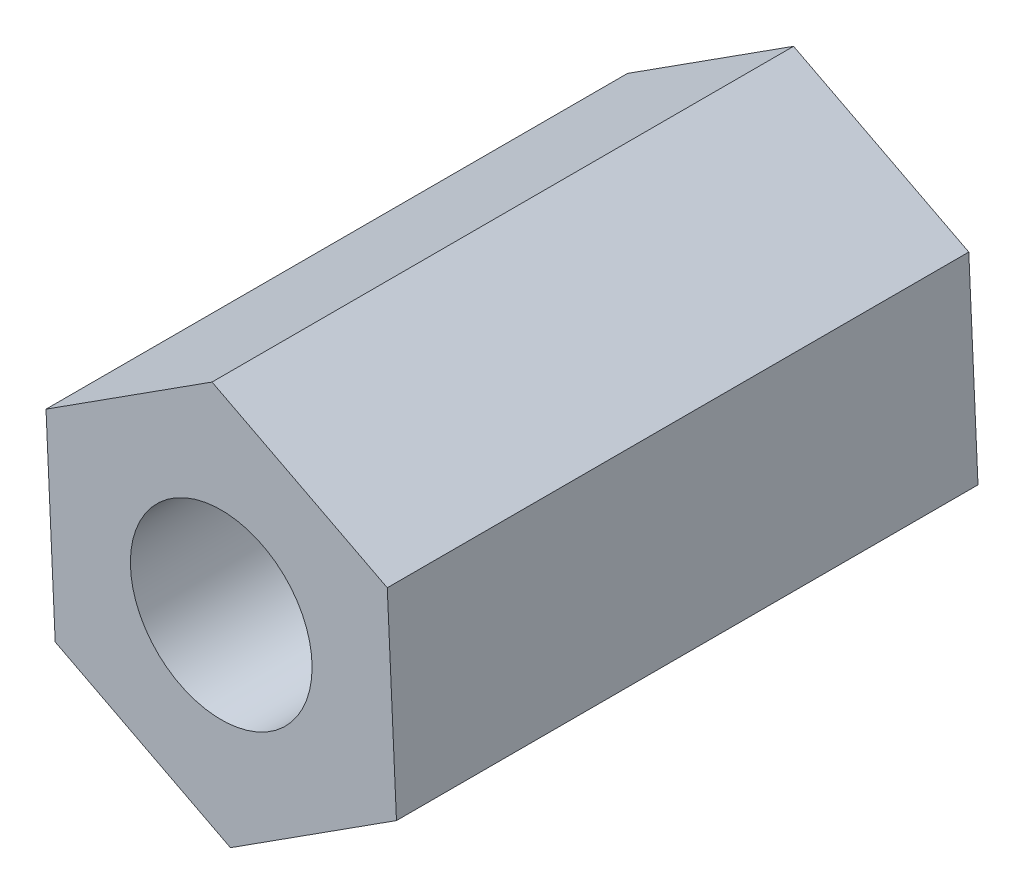
ISO-10303-21;
HEADER;
FILE_DESCRIPTION(('STEP AP214'),'2;1');
FILE_NAME('part.step','',(''),(''),'','','');
FILE_SCHEMA(('AUTOMOTIVE_DESIGN { 1 0 10303 214 1 1 1 1 }'));
ENDSEC;
DATA;
#1=APPLICATION_CONTEXT('core data for automotive mechanical design processes');
#2=APPLICATION_PROTOCOL_DEFINITION('international standard','automotive_design',2000,#1);
#3=PRODUCT_CONTEXT('',#1,'mechanical');
#4=PRODUCT('Part','Part','',(#3));
#5=PRODUCT_RELATED_PRODUCT_CATEGORY('part','',(#4));
#6=PRODUCT_DEFINITION_FORMATION('','',#4);
#7=PRODUCT_DEFINITION_CONTEXT('part definition',#1,'design');
#8=PRODUCT_DEFINITION('design','',#6,#7);
#9=PRODUCT_DEFINITION_SHAPE('','',#8);
#10=(LENGTH_UNIT() NAMED_UNIT(*) SI_UNIT(.MILLI.,.METRE.));
#11=(NAMED_UNIT(*) PLANE_ANGLE_UNIT() SI_UNIT($,.RADIAN.));
#12=(NAMED_UNIT(*) SI_UNIT($,.STERADIAN.) SOLID_ANGLE_UNIT());
#13=UNCERTAINTY_MEASURE_WITH_UNIT(LENGTH_MEASURE(1.E-05),#10,'distance_accuracy_value','');
#14=(GEOMETRIC_REPRESENTATION_CONTEXT(3) GLOBAL_UNCERTAINTY_ASSIGNED_CONTEXT((#13)) GLOBAL_UNIT_ASSIGNED_CONTEXT((#10,
#11,#12)) REPRESENTATION_CONTEXT('',''));
#15=CARTESIAN_POINT('',(0.,0.,0.));
#16=DIRECTION('',(0.,0.,1.));
#17=DIRECTION('',(1.,0.,0.));
#18=AXIS2_PLACEMENT_3D('',#15,#16,#17);
#19=CARTESIAN_POINT('',(2.28413969945886,1.46493657428891,8.));
#20=DIRECTION('',(-0.459050481047052,-0.888410184458998,0.));
#21=DIRECTION('',(0.888410184458998,-0.459050481047052,0.));
#22=AXIS2_PLACEMENT_3D('',#19,#20,#21);
#23=PLANE('',#22);
#24=DIRECTION('',(-0.888410184458997,0.459050481047052,0.));
#25=VECTOR('',#24,1.);
#26=CARTESIAN_POINT('',(2.28413969945886,1.46493657428891,0.));
#27=LINE('',#26,#25);
#28=CARTESIAN_POINT('',(2.28413969945886,1.46493657428891,0.));
#29=VERTEX_POINT('',#28);
#30=CARTESIAN_POINT('',(-0.126602438537715,2.71059129266838,0.));
#31=VERTEX_POINT('',#30);
#32=EDGE_CURVE('E120',#29,#31,#27,.T.);
#33=ORIENTED_EDGE('',*,*,#32,.T.);
#34=DIRECTION('',(0.,0.,-1.));
#35=VECTOR('',#34,1.);
#36=CARTESIAN_POINT('',(-0.126602438537715,2.71059129266838,8.));
#37=LINE('',#36,#35);
#38=CARTESIAN_POINT('',(-0.126602438537715,2.71059129266838,8.));
#39=VERTEX_POINT('',#38);
#40=EDGE_CURVE('E11',#39,#31,#37,.T.);
#41=ORIENTED_EDGE('',*,*,#40,.F.);
#42=DIRECTION('',(-0.888410184458997,0.459050481047052,0.));
#43=VECTOR('',#42,1.);
#44=CARTESIAN_POINT('',(2.28413969945886,1.46493657428891,8.));
#45=LINE('',#44,#43);
#46=CARTESIAN_POINT('',(2.28413969945886,1.46493657428891,8.));
#47=VERTEX_POINT('',#46);
#48=EDGE_CURVE('E131',#47,#39,#45,.T.);
#49=ORIENTED_EDGE('',*,*,#48,.F.);
#50=DIRECTION('',(0.,0.,-1.));
#51=VECTOR('',#50,1.);
#52=CARTESIAN_POINT('',(2.28413969945886,1.46493657428891,8.));
#53=LINE('',#52,#51);
#54=EDGE_CURVE('E116',#47,#29,#53,.T.);
#55=ORIENTED_EDGE('',*,*,#54,.T.);
#56=EDGE_LOOP('',(#33,#41,#49,#55));
#57=FACE_BOUND('',#56,.T.);
#58=ADVANCED_FACE('F36',(#57),#23,.F.);
#59=CARTESIAN_POINT('',(-0.126602438537715,2.71059129266838,8.));
#60=DIRECTION('',(0.539860548198785,-0.841754470435713,0.));
#61=DIRECTION('',(0.841754470435713,0.539860548198785,0.));
#62=AXIS2_PLACEMENT_3D('',#59,#60,#61);
#63=PLANE('',#62);
#64=DIRECTION('',(-0.841754470435713,-0.539860548198785,0.));
#65=VECTOR('',#64,1.);
#66=CARTESIAN_POINT('',(-0.126602438537715,2.71059129266838,0.));
#67=LINE('',#66,#65);
#68=CARTESIAN_POINT('',(-2.41074213799657,1.24565471837947,0.));
#69=VERTEX_POINT('',#68);
#70=EDGE_CURVE('E123',#31,#69,#67,.T.);
#71=ORIENTED_EDGE('',*,*,#70,.T.);
#72=DIRECTION('',(0.,0.,-1.));
#73=VECTOR('',#72,1.);
#74=CARTESIAN_POINT('',(-2.41074213799657,1.24565471837947,8.));
#75=LINE('',#74,#73);
#76=CARTESIAN_POINT('',(-2.41074213799657,1.24565471837947,8.));
#77=VERTEX_POINT('',#76);
#78=EDGE_CURVE('E44',#77,#69,#75,.T.);
#79=ORIENTED_EDGE('',*,*,#78,.F.);
#80=DIRECTION('',(-0.841754470435713,-0.539860548198785,0.));
#81=VECTOR('',#80,1.);
#82=CARTESIAN_POINT('',(-0.126602438537715,2.71059129266838,8.));
#83=LINE('',#82,#81);
#84=EDGE_CURVE('E89',#39,#77,#83,.T.);
#85=ORIENTED_EDGE('',*,*,#84,.F.);
#86=ORIENTED_EDGE('',*,*,#40,.T.);
#87=EDGE_LOOP('',(#71,#79,#85,#86));
#88=FACE_BOUND('',#87,.T.);
#89=ADVANCED_FACE('F156',(#88),#63,.F.);
#90=CARTESIAN_POINT('',(-2.41074213799657,1.24565471837947,8.));
#91=DIRECTION('',(0.998911029245837,0.0466557140232844,0.));
#92=DIRECTION('',(-0.0466557140232844,0.998911029245837,0.));
#93=AXIS2_PLACEMENT_3D('',#90,#91,#92);
#94=PLANE('',#93);
#95=DIRECTION('',(0.0466557140232844,-0.998911029245837,0.));
#96=VECTOR('',#95,1.);
#97=CARTESIAN_POINT('',(-2.41074213799657,1.24565471837947,0.));
#98=LINE('',#97,#96);
#99=CARTESIAN_POINT('',(-2.28413969945886,-1.46493657428891,0.));
#100=VERTEX_POINT('',#99);
#101=EDGE_CURVE('E126',#69,#100,#98,.T.);
#102=ORIENTED_EDGE('',*,*,#101,.T.);
#103=DIRECTION('',(0.,0.,-1.));
#104=VECTOR('',#103,1.);
#105=CARTESIAN_POINT('',(-2.28413969945886,-1.46493657428891,8.));
#106=LINE('',#105,#104);
#107=CARTESIAN_POINT('',(-2.28413969945886,-1.46493657428891,8.));
#108=VERTEX_POINT('',#107);
#109=EDGE_CURVE('E111',#108,#100,#106,.T.);
#110=ORIENTED_EDGE('',*,*,#109,.F.);
#111=DIRECTION('',(0.0466557140232844,-0.998911029245837,0.));
#112=VECTOR('',#111,1.);
#113=CARTESIAN_POINT('',(-2.41074213799657,1.24565471837947,8.));
#114=LINE('',#113,#112);
#115=EDGE_CURVE('E102',#77,#108,#114,.T.);
#116=ORIENTED_EDGE('',*,*,#115,.F.);
#117=ORIENTED_EDGE('',*,*,#78,.T.);
#118=EDGE_LOOP('',(#102,#110,#116,#117));
#119=FACE_BOUND('',#118,.T.);
#120=ADVANCED_FACE('F137',(#119),#94,.F.);
#121=CARTESIAN_POINT('',(-2.28413969945886,-1.46493657428891,8.));
#122=DIRECTION('',(0.459050481047052,0.888410184458998,0.));
#123=DIRECTION('',(-0.888410184458998,0.459050481047052,0.));
#124=AXIS2_PLACEMENT_3D('',#121,#122,#123);
#125=PLANE('',#124);
#126=DIRECTION('',(0.888410184458997,-0.459050481047052,0.));
#127=VECTOR('',#126,1.);
#128=CARTESIAN_POINT('',(-2.28413969945886,-1.46493657428891,0.));
#129=LINE('',#128,#127);
#130=CARTESIAN_POINT('',(0.126602438537714,-2.71059129266838,0.));
#131=VERTEX_POINT('',#130);
#132=EDGE_CURVE('E110',#100,#131,#129,.T.);
#133=ORIENTED_EDGE('',*,*,#132,.T.);
#134=DIRECTION('',(0.,0.,-1.));
#135=VECTOR('',#134,1.);
#136=CARTESIAN_POINT('',(0.126602438537714,-2.71059129266838,8.));
#137=LINE('',#136,#135);
#138=CARTESIAN_POINT('',(0.126602438537714,-2.71059129266838,8.));
#139=VERTEX_POINT('',#138);
#140=EDGE_CURVE('E107',#139,#131,#137,.T.);
#141=ORIENTED_EDGE('',*,*,#140,.F.);
#142=DIRECTION('',(0.888410184458997,-0.459050481047052,0.));
#143=VECTOR('',#142,1.);
#144=CARTESIAN_POINT('',(-2.28413969945886,-1.46493657428891,8.));
#145=LINE('',#144,#143);
#146=EDGE_CURVE('E96',#108,#139,#145,.T.);
#147=ORIENTED_EDGE('',*,*,#146,.F.);
#148=ORIENTED_EDGE('',*,*,#109,.T.);
#149=EDGE_LOOP('',(#133,#141,#147,#148));
#150=FACE_BOUND('',#149,.T.);
#151=ADVANCED_FACE('F108',(#150),#125,.F.);
#152=CARTESIAN_POINT('',(0.126602438537714,-2.71059129266838,8.));
#153=DIRECTION('',(-0.539860548198785,0.841754470435713,0.));
#154=DIRECTION('',(-0.841754470435713,-0.539860548198785,0.));
#155=AXIS2_PLACEMENT_3D('',#152,#153,#154);
#156=PLANE('',#155);
#157=DIRECTION('',(0.841754470435713,0.539860548198785,0.));
#158=VECTOR('',#157,1.);
#159=CARTESIAN_POINT('',(0.126602438537714,-2.71059129266838,0.));
#160=LINE('',#159,#158);
#161=CARTESIAN_POINT('',(2.41074213799657,-1.24565471837947,0.));
#162=VERTEX_POINT('',#161);
#163=EDGE_CURVE('E75',#131,#162,#160,.T.);
#164=ORIENTED_EDGE('',*,*,#163,.T.);
#165=DIRECTION('',(0.,0.,-1.));
#166=VECTOR('',#165,1.);
#167=CARTESIAN_POINT('',(2.41074213799657,-1.24565471837947,8.));
#168=LINE('',#167,#166);
#169=CARTESIAN_POINT('',(2.41074213799657,-1.24565471837947,8.));
#170=VERTEX_POINT('',#169);
#171=EDGE_CURVE('E112',#170,#162,#168,.T.);
#172=ORIENTED_EDGE('',*,*,#171,.F.);
#173=DIRECTION('',(0.841754470435713,0.539860548198785,0.));
#174=VECTOR('',#173,1.);
#175=CARTESIAN_POINT('',(0.126602438537714,-2.71059129266838,8.));
#176=LINE('',#175,#174);
#177=EDGE_CURVE('E100',#139,#170,#176,.T.);
#178=ORIENTED_EDGE('',*,*,#177,.F.);
#179=ORIENTED_EDGE('',*,*,#140,.T.);
#180=EDGE_LOOP('',(#164,#172,#178,#179));
#181=FACE_BOUND('',#180,.T.);
#182=ADVANCED_FACE('F114',(#181),#156,.F.);
#183=CARTESIAN_POINT('',(2.41074213799657,-1.24565471837947,8.));
#184=DIRECTION('',(-0.998911029245837,-0.0466557140232842,0.));
#185=DIRECTION('',(0.0466557140232842,-0.998911029245837,0.));
#186=AXIS2_PLACEMENT_3D('',#183,#184,#185);
#187=PLANE('',#186);
#188=DIRECTION('',(-0.0466557140232842,0.998911029245837,0.));
#189=VECTOR('',#188,1.);
#190=CARTESIAN_POINT('',(2.41074213799657,-1.24565471837947,0.));
#191=LINE('',#190,#189);
#192=EDGE_CURVE('E81',#162,#29,#191,.T.);
#193=ORIENTED_EDGE('',*,*,#192,.T.);
#194=ORIENTED_EDGE('',*,*,#54,.F.);
#195=DIRECTION('',(-0.0466557140232842,0.998911029245837,0.));
#196=VECTOR('',#195,1.);
#197=CARTESIAN_POINT('',(2.41074213799657,-1.24565471837947,8.));
#198=LINE('',#197,#196);
#199=EDGE_CURVE('E52',#170,#47,#198,.T.);
#200=ORIENTED_EDGE('',*,*,#199,.F.);
#201=ORIENTED_EDGE('',*,*,#171,.T.);
#202=EDGE_LOOP('',(#193,#194,#200,#201));
#203=FACE_BOUND('',#202,.T.);
#204=ADVANCED_FACE('F144',(#203),#187,.F.);
#205=CARTESIAN_POINT('',(0.,0.,8.));
#206=DIRECTION('',(0.,0.,1.));
#207=DIRECTION('',(1.,0.,0.));
#208=AXIS2_PLACEMENT_3D('',#205,#206,#207);
#209=PLANE('',#208);
#210=CARTESIAN_POINT('',(0.,0.,8.));
#211=DIRECTION('',(0.,0.,-1.));
#212=DIRECTION('',(-1.,0.,0.));
#213=AXIS2_PLACEMENT_3D('',#210,#211,#212);
#214=CIRCLE('',#213,1.25);
#215=CARTESIAN_POINT('',(-1.25,0.,8.));
#216=VERTEX_POINT('',#215);
#217=EDGE_CURVE('E124',#216,#216,#214,.T.);
#218=ORIENTED_EDGE('',*,*,#217,.T.);
#219=EDGE_LOOP('',(#218));
#220=FACE_BOUND('',#219,.T.);
#221=ORIENTED_EDGE('',*,*,#48,.T.);
#222=ORIENTED_EDGE('',*,*,#84,.T.);
#223=ORIENTED_EDGE('',*,*,#115,.T.);
#224=ORIENTED_EDGE('',*,*,#146,.T.);
#225=ORIENTED_EDGE('',*,*,#177,.T.);
#226=ORIENTED_EDGE('',*,*,#199,.T.);
#227=EDGE_LOOP('',(#221,#222,#223,#224,#225,#226));
#228=FACE_BOUND('',#227,.T.);
#229=ADVANCED_FACE('F98',(#220,#228),#209,.T.);
#230=CARTESIAN_POINT('',(0.,0.,0.));
#231=DIRECTION('',(0.,0.,1.));
#232=DIRECTION('',(1.,0.,0.));
#233=AXIS2_PLACEMENT_3D('',#230,#231,#232);
#234=PLANE('',#233);
#235=CARTESIAN_POINT('',(0.,0.,0.));
#236=DIRECTION('',(0.,0.,-1.));
#237=DIRECTION('',(-1.,0.,0.));
#238=AXIS2_PLACEMENT_3D('',#235,#236,#237);
#239=CIRCLE('',#238,1.24999999999999);
#240=CARTESIAN_POINT('',(-1.24999999999999,0.,0.));
#241=VERTEX_POINT('',#240);
#242=EDGE_CURVE('E213',#241,#241,#239,.T.);
#243=ORIENTED_EDGE('',*,*,#242,.F.);
#244=EDGE_LOOP('',(#243));
#245=FACE_BOUND('',#244,.T.);
#246=ORIENTED_EDGE('',*,*,#32,.F.);
#247=ORIENTED_EDGE('',*,*,#192,.F.);
#248=ORIENTED_EDGE('',*,*,#163,.F.);
#249=ORIENTED_EDGE('',*,*,#132,.F.);
#250=ORIENTED_EDGE('',*,*,#101,.F.);
#251=ORIENTED_EDGE('',*,*,#70,.F.);
#252=EDGE_LOOP('',(#246,#247,#248,#249,#250,#251));
#253=FACE_BOUND('',#252,.T.);
#254=ADVANCED_FACE('F140',(#245,#253),#234,.F.);
#255=CARTESIAN_POINT('',(0.,0.,0.));
#256=DIRECTION('',(0.,0.,-1.));
#257=DIRECTION('',(-1.,0.,0.));
#258=AXIS2_PLACEMENT_3D('',#255,#256,#257);
#259=CYLINDRICAL_SURFACE('',#258,1.24999999999999);
#260=ORIENTED_EDGE('',*,*,#217,.F.);
#261=EDGE_LOOP('',(#260));
#262=FACE_BOUND('',#261,.T.);
#263=ORIENTED_EDGE('',*,*,#242,.T.);
#264=EDGE_LOOP('',(#263));
#265=FACE_BOUND('',#264,.T.);
#266=ADVANCED_FACE('F193',(#262,#265),#259,.F.);
#267=CLOSED_SHELL('',(#58,#89,#120,#151,#182,#204,#229,#254,#266));
#268=MANIFOLD_SOLID_BREP('B2',#267);
#269=ADVANCED_BREP_SHAPE_REPRESENTATION('',(#18,#268),#14);
#270=SHAPE_DEFINITION_REPRESENTATION(#9,#269);
ENDSEC;
END-ISO-10303-21;
